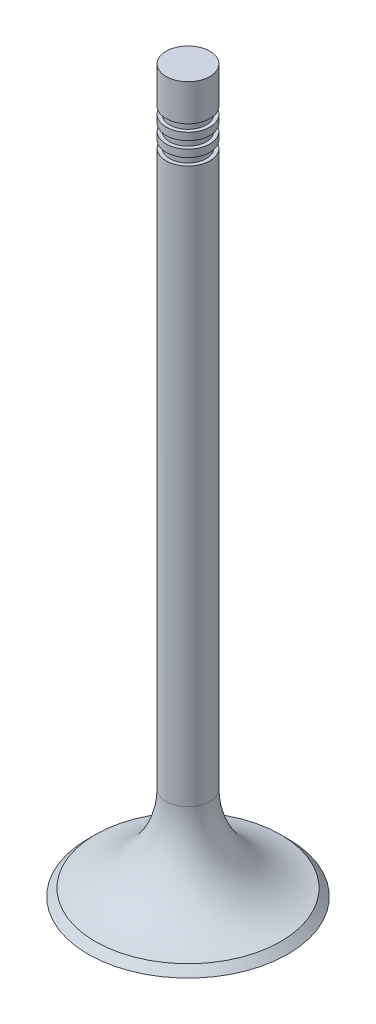
ISO-10303-21;
HEADER;
FILE_DESCRIPTION(('STEP AP214'),'2;1');
FILE_NAME('part.step','',(''),(''),'','','');
FILE_SCHEMA(('AUTOMOTIVE_DESIGN { 1 0 10303 214 1 1 1 1 }'));
ENDSEC;
DATA;
#1=APPLICATION_CONTEXT('core data for automotive mechanical design processes');
#2=APPLICATION_PROTOCOL_DEFINITION('international standard','automotive_design',2000,#1);
#3=PRODUCT_CONTEXT('',#1,'mechanical');
#4=PRODUCT('Part','Part','',(#3));
#5=PRODUCT_RELATED_PRODUCT_CATEGORY('part','',(#4));
#6=PRODUCT_DEFINITION_FORMATION('','',#4);
#7=PRODUCT_DEFINITION_CONTEXT('part definition',#1,'design');
#8=PRODUCT_DEFINITION('design','',#6,#7);
#9=PRODUCT_DEFINITION_SHAPE('','',#8);
#10=(LENGTH_UNIT() NAMED_UNIT(*) SI_UNIT(.MILLI.,.METRE.));
#11=(NAMED_UNIT(*) PLANE_ANGLE_UNIT() SI_UNIT($,.RADIAN.));
#12=(NAMED_UNIT(*) SI_UNIT($,.STERADIAN.) SOLID_ANGLE_UNIT());
#13=UNCERTAINTY_MEASURE_WITH_UNIT(LENGTH_MEASURE(1.E-05),#10,'distance_accuracy_value','');
#14=(GEOMETRIC_REPRESENTATION_CONTEXT(3) GLOBAL_UNCERTAINTY_ASSIGNED_CONTEXT((#13)) GLOBAL_UNIT_ASSIGNED_CONTEXT((#10,
#11,#12)) REPRESENTATION_CONTEXT('',''));
#15=CARTESIAN_POINT('',(0.,0.,0.));
#16=DIRECTION('',(0.,0.,1.));
#17=DIRECTION('',(1.,0.,0.));
#18=AXIS2_PLACEMENT_3D('',#15,#16,#17);
#19=CARTESIAN_POINT('',(0.,0.,0.));
#20=DIRECTION('',(0.,1.,0.));
#21=DIRECTION('',(0.,0.,1.));
#22=AXIS2_PLACEMENT_3D('',#19,#20,#21);
#23=PLANE('',#22);
#24=CARTESIAN_POINT('',(0.,0.,0.));
#25=DIRECTION('',(0.,1.,0.));
#26=DIRECTION('',(0.,0.,1.));
#27=AXIS2_PLACEMENT_3D('',#24,#25,#26);
#28=CIRCLE('',#27,13.7);
#29=CARTESIAN_POINT('',(0.,0.,13.7));
#30=VERTEX_POINT('',#29);
#31=EDGE_CURVE('E58',#30,#30,#28,.T.);
#32=ORIENTED_EDGE('',*,*,#31,.F.);
#33=EDGE_LOOP('',(#32));
#34=FACE_BOUND('',#33,.T.);
#35=ADVANCED_FACE('F45',(#34),#23,.F.);
#36=CARTESIAN_POINT('',(0.,1.,0.));
#37=DIRECTION('',(0.,-1.,0.));
#38=DIRECTION('',(0.,0.,-1.));
#39=AXIS2_PLACEMENT_3D('',#36,#37,#38);
#40=CONICAL_SURFACE('',#39,12.7,0.785398163397444);
#41=ORIENTED_EDGE('',*,*,#31,.T.);
#42=EDGE_LOOP('',(#41));
#43=FACE_BOUND('',#42,.T.);
#44=CARTESIAN_POINT('',(0.,1.,0.));
#45=DIRECTION('',(0.,1.,0.));
#46=DIRECTION('',(0.,0.,1.));
#47=AXIS2_PLACEMENT_3D('',#44,#45,#46);
#48=CIRCLE('',#47,12.7);
#49=CARTESIAN_POINT('',(0.,1.,12.7));
#50=VERTEX_POINT('',#49);
#51=EDGE_CURVE('E53',#50,#50,#48,.T.);
#52=ORIENTED_EDGE('',*,*,#51,.F.);
#53=EDGE_LOOP('',(#52));
#54=FACE_BOUND('',#53,.T.);
#55=ADVANCED_FACE('F152',(#43,#54),#40,.T.);
#56=CARTESIAN_POINT('',(0.,98.8,0.));
#57=DIRECTION('',(0.,-1.,0.));
#58=DIRECTION('',(0.,0.,-1.));
#59=AXIS2_PLACEMENT_3D('',#56,#57,#58);
#60=CYLINDRICAL_SURFACE('',#59,3.);
#61=CARTESIAN_POINT('',(0.,88.8,0.));
#62=DIRECTION('',(0.,1.,0.));
#63=DIRECTION('',(0.,0.,1.));
#64=AXIS2_PLACEMENT_3D('',#61,#62,#63);
#65=CIRCLE('',#64,3.);
#66=CARTESIAN_POINT('',(0.,88.8,3.));
#67=VERTEX_POINT('',#66);
#68=EDGE_CURVE('E79',#67,#67,#65,.T.);
#69=ORIENTED_EDGE('',*,*,#68,.F.);
#70=EDGE_LOOP('',(#69));
#71=FACE_BOUND('',#70,.T.);
#72=CARTESIAN_POINT('',(0.,12.7775209615606,0.));
#73=DIRECTION('',(0.,-1.,0.));
#74=DIRECTION('',(0.,0.,-1.));
#75=AXIS2_PLACEMENT_3D('',#72,#73,#74);
#76=CIRCLE('',#75,3.);
#77=CARTESIAN_POINT('',(0.,12.7775209615606,-3.));
#78=VERTEX_POINT('',#77);
#79=EDGE_CURVE('E10',#78,#78,#76,.F.);
#80=ORIENTED_EDGE('',*,*,#79,.T.);
#81=EDGE_LOOP('',(#80));
#82=FACE_BOUND('',#81,.T.);
#83=ADVANCED_FACE('F158',(#71,#82),#60,.T.);
#84=CARTESIAN_POINT('',(0.,12.7775209615606,0.));
#85=DIRECTION('',(0.,-1.,0.));
#86=DIRECTION('',(0.,0.,-1.));
#87=AXIS2_PLACEMENT_3D('',#84,#85,#86);
#88=TOROIDAL_SURFACE('',#87,15.,12.);
#89=ORIENTED_EDGE('',*,*,#51,.T.);
#90=EDGE_LOOP('',(#89));
#91=FACE_BOUND('',#90,.T.);
#92=ORIENTED_EDGE('',*,*,#79,.F.);
#93=EDGE_LOOP('',(#92));
#94=FACE_BOUND('',#93,.T.);
#95=ADVANCED_FACE('F47',(#91,#94),#88,.F.);
#96=CARTESIAN_POINT('',(0.,98.8,0.));
#97=DIRECTION('',(0.,1.,0.));
#98=DIRECTION('',(0.,0.,1.));
#99=AXIS2_PLACEMENT_3D('',#96,#97,#98);
#100=CYLINDRICAL_SURFACE('',#99,2.5);
#101=CARTESIAN_POINT('',(0.,88.8,0.));
#102=DIRECTION('',(0.,1.,0.));
#103=DIRECTION('',(0.,0.,1.));
#104=AXIS2_PLACEMENT_3D('',#101,#102,#103);
#105=CIRCLE('',#104,2.5);
#106=CARTESIAN_POINT('',(0.,88.8,2.5));
#107=VERTEX_POINT('',#106);
#108=EDGE_CURVE('E83',#107,#107,#105,.T.);
#109=ORIENTED_EDGE('',*,*,#108,.T.);
#110=EDGE_LOOP('',(#109));
#111=FACE_BOUND('',#110,.T.);
#112=CARTESIAN_POINT('',(0.,89.8,0.));
#113=DIRECTION('',(0.,1.,0.));
#114=DIRECTION('',(0.,0.,1.));
#115=AXIS2_PLACEMENT_3D('',#112,#113,#114);
#116=CIRCLE('',#115,2.5);
#117=CARTESIAN_POINT('',(0.,89.8,2.5));
#118=VERTEX_POINT('',#117);
#119=EDGE_CURVE('E70',#118,#118,#116,.T.);
#120=ORIENTED_EDGE('',*,*,#119,.F.);
#121=EDGE_LOOP('',(#120));
#122=FACE_BOUND('',#121,.T.);
#123=ADVANCED_FACE('F170',(#111,#122),#100,.T.);
#124=CARTESIAN_POINT('',(0.,89.8,0.));
#125=DIRECTION('',(0.,-1.,0.));
#126=DIRECTION('',(0.,0.,-1.));
#127=AXIS2_PLACEMENT_3D('',#124,#125,#126);
#128=PLANE('',#127);
#129=ORIENTED_EDGE('',*,*,#119,.T.);
#130=EDGE_LOOP('',(#129));
#131=FACE_BOUND('',#130,.T.);
#132=CARTESIAN_POINT('',(0.,89.8,0.));
#133=DIRECTION('',(0.,1.,0.));
#134=DIRECTION('',(0.,0.,1.));
#135=AXIS2_PLACEMENT_3D('',#132,#133,#134);
#136=CIRCLE('',#135,3.);
#137=CARTESIAN_POINT('',(0.,89.8,3.));
#138=VERTEX_POINT('',#137);
#139=EDGE_CURVE('E75',#138,#138,#136,.T.);
#140=ORIENTED_EDGE('',*,*,#139,.F.);
#141=EDGE_LOOP('',(#140));
#142=FACE_BOUND('',#141,.T.);
#143=ADVANCED_FACE('F173',(#131,#142),#128,.T.);
#144=CARTESIAN_POINT('',(0.,88.8,0.));
#145=DIRECTION('',(0.,-1.,0.));
#146=DIRECTION('',(0.,0.,-1.));
#147=AXIS2_PLACEMENT_3D('',#144,#145,#146);
#148=PLANE('',#147);
#149=ORIENTED_EDGE('',*,*,#108,.F.);
#150=EDGE_LOOP('',(#149));
#151=FACE_BOUND('',#150,.T.);
#152=ORIENTED_EDGE('',*,*,#68,.T.);
#153=EDGE_LOOP('',(#152));
#154=FACE_BOUND('',#153,.T.);
#155=ADVANCED_FACE('F177',(#151,#154),#148,.F.);
#156=CARTESIAN_POINT('',(0.,90.8,0.));
#157=DIRECTION('',(0.,1.,0.));
#158=DIRECTION('',(0.,0.,1.));
#159=AXIS2_PLACEMENT_3D('',#156,#157,#158);
#160=CIRCLE('',#159,3.);
#161=CARTESIAN_POINT('',(0.,90.8,3.));
#162=VERTEX_POINT('',#161);
#163=EDGE_CURVE('E96',#162,#162,#160,.T.);
#164=ORIENTED_EDGE('',*,*,#163,.F.);
#165=EDGE_LOOP('',(#164));
#166=FACE_BOUND('',#165,.T.);
#167=ORIENTED_EDGE('',*,*,#139,.T.);
#168=EDGE_LOOP('',(#167));
#169=FACE_BOUND('',#168,.T.);
#170=ADVANCED_FACE('F134',(#166,#169),#60,.T.);
#171=CARTESIAN_POINT('',(0.,98.8,0.));
#172=DIRECTION('',(0.,1.,0.));
#173=DIRECTION('',(0.,0.,1.));
#174=AXIS2_PLACEMENT_3D('',#171,#172,#173);
#175=CYLINDRICAL_SURFACE('',#174,2.5);
#176=CARTESIAN_POINT('',(0.,90.8,0.));
#177=DIRECTION('',(0.,1.,0.));
#178=DIRECTION('',(0.,0.,1.));
#179=AXIS2_PLACEMENT_3D('',#176,#177,#178);
#180=CIRCLE('',#179,2.5);
#181=CARTESIAN_POINT('',(0.,90.8,2.5));
#182=VERTEX_POINT('',#181);
#183=EDGE_CURVE('E74',#182,#182,#180,.T.);
#184=ORIENTED_EDGE('',*,*,#183,.T.);
#185=EDGE_LOOP('',(#184));
#186=FACE_BOUND('',#185,.T.);
#187=CARTESIAN_POINT('',(0.,91.8,0.));
#188=DIRECTION('',(0.,1.,0.));
#189=DIRECTION('',(0.,0.,1.));
#190=AXIS2_PLACEMENT_3D('',#187,#188,#189);
#191=CIRCLE('',#190,2.5);
#192=CARTESIAN_POINT('',(0.,91.8,2.5));
#193=VERTEX_POINT('',#192);
#194=EDGE_CURVE('E87',#193,#193,#191,.T.);
#195=ORIENTED_EDGE('',*,*,#194,.F.);
#196=EDGE_LOOP('',(#195));
#197=FACE_BOUND('',#196,.T.);
#198=ADVANCED_FACE('F140',(#186,#197),#175,.T.);
#199=CARTESIAN_POINT('',(0.,91.8,0.));
#200=DIRECTION('',(0.,-1.,0.));
#201=DIRECTION('',(0.,0.,-1.));
#202=AXIS2_PLACEMENT_3D('',#199,#200,#201);
#203=PLANE('',#202);
#204=ORIENTED_EDGE('',*,*,#194,.T.);
#205=EDGE_LOOP('',(#204));
#206=FACE_BOUND('',#205,.T.);
#207=CARTESIAN_POINT('',(0.,91.8,0.));
#208=DIRECTION('',(0.,1.,0.));
#209=DIRECTION('',(0.,0.,1.));
#210=AXIS2_PLACEMENT_3D('',#207,#208,#209);
#211=CIRCLE('',#210,3.);
#212=CARTESIAN_POINT('',(0.,91.8,3.));
#213=VERTEX_POINT('',#212);
#214=EDGE_CURVE('E92',#213,#213,#211,.T.);
#215=ORIENTED_EDGE('',*,*,#214,.F.);
#216=EDGE_LOOP('',(#215));
#217=FACE_BOUND('',#216,.T.);
#218=ADVANCED_FACE('F138',(#206,#217),#203,.T.);
#219=CARTESIAN_POINT('',(0.,90.8,0.));
#220=DIRECTION('',(0.,-1.,0.));
#221=DIRECTION('',(0.,0.,-1.));
#222=AXIS2_PLACEMENT_3D('',#219,#220,#221);
#223=PLANE('',#222);
#224=ORIENTED_EDGE('',*,*,#183,.F.);
#225=EDGE_LOOP('',(#224));
#226=FACE_BOUND('',#225,.T.);
#227=ORIENTED_EDGE('',*,*,#163,.T.);
#228=EDGE_LOOP('',(#227));
#229=FACE_BOUND('',#228,.T.);
#230=ADVANCED_FACE('F132',(#226,#229),#223,.F.);
#231=CARTESIAN_POINT('',(0.,92.8,0.));
#232=DIRECTION('',(0.,1.,0.));
#233=DIRECTION('',(0.,0.,1.));
#234=AXIS2_PLACEMENT_3D('',#231,#232,#233);
#235=CIRCLE('',#234,3.);
#236=CARTESIAN_POINT('',(0.,92.8,3.));
#237=VERTEX_POINT('',#236);
#238=EDGE_CURVE('E110',#237,#237,#235,.T.);
#239=ORIENTED_EDGE('',*,*,#238,.F.);
#240=EDGE_LOOP('',(#239));
#241=FACE_BOUND('',#240,.T.);
#242=ORIENTED_EDGE('',*,*,#214,.T.);
#243=EDGE_LOOP('',(#242));
#244=FACE_BOUND('',#243,.T.);
#245=ADVANCED_FACE('F129',(#241,#244),#60,.T.);
#246=CARTESIAN_POINT('',(0.,98.8,0.));
#247=DIRECTION('',(0.,1.,0.));
#248=DIRECTION('',(0.,0.,1.));
#249=AXIS2_PLACEMENT_3D('',#246,#247,#248);
#250=CYLINDRICAL_SURFACE('',#249,2.5);
#251=CARTESIAN_POINT('',(0.,92.8,0.));
#252=DIRECTION('',(0.,1.,0.));
#253=DIRECTION('',(0.,0.,1.));
#254=AXIS2_PLACEMENT_3D('',#251,#252,#253);
#255=CIRCLE('',#254,2.5);
#256=CARTESIAN_POINT('',(0.,92.8,2.5));
#257=VERTEX_POINT('',#256);
#258=EDGE_CURVE('E91',#257,#257,#255,.T.);
#259=ORIENTED_EDGE('',*,*,#258,.T.);
#260=EDGE_LOOP('',(#259));
#261=FACE_BOUND('',#260,.T.);
#262=CARTESIAN_POINT('',(0.,93.8,0.));
#263=DIRECTION('',(0.,1.,0.));
#264=DIRECTION('',(0.,0.,1.));
#265=AXIS2_PLACEMENT_3D('',#262,#263,#264);
#266=CIRCLE('',#265,2.5);
#267=CARTESIAN_POINT('',(0.,93.8,2.5));
#268=VERTEX_POINT('',#267);
#269=EDGE_CURVE('E69',#268,#268,#266,.T.);
#270=ORIENTED_EDGE('',*,*,#269,.F.);
#271=EDGE_LOOP('',(#270));
#272=FACE_BOUND('',#271,.T.);
#273=ADVANCED_FACE('F118',(#261,#272),#250,.T.);
#274=CARTESIAN_POINT('',(0.,93.8,0.));
#275=DIRECTION('',(0.,-1.,0.));
#276=DIRECTION('',(0.,0.,-1.));
#277=AXIS2_PLACEMENT_3D('',#274,#275,#276);
#278=PLANE('',#277);
#279=ORIENTED_EDGE('',*,*,#269,.T.);
#280=EDGE_LOOP('',(#279));
#281=FACE_BOUND('',#280,.T.);
#282=CARTESIAN_POINT('',(0.,93.8,0.));
#283=DIRECTION('',(0.,1.,0.));
#284=DIRECTION('',(0.,0.,1.));
#285=AXIS2_PLACEMENT_3D('',#282,#283,#284);
#286=CIRCLE('',#285,3.);
#287=CARTESIAN_POINT('',(0.,93.8,3.));
#288=VERTEX_POINT('',#287);
#289=EDGE_CURVE('E106',#288,#288,#286,.T.);
#290=ORIENTED_EDGE('',*,*,#289,.F.);
#291=EDGE_LOOP('',(#290));
#292=FACE_BOUND('',#291,.T.);
#293=ADVANCED_FACE('F125',(#281,#292),#278,.T.);
#294=CARTESIAN_POINT('',(0.,92.8,0.));
#295=DIRECTION('',(0.,-1.,0.));
#296=DIRECTION('',(0.,0.,-1.));
#297=AXIS2_PLACEMENT_3D('',#294,#295,#296);
#298=PLANE('',#297);
#299=ORIENTED_EDGE('',*,*,#258,.F.);
#300=EDGE_LOOP('',(#299));
#301=FACE_BOUND('',#300,.T.);
#302=ORIENTED_EDGE('',*,*,#238,.T.);
#303=EDGE_LOOP('',(#302));
#304=FACE_BOUND('',#303,.T.);
#305=ADVANCED_FACE('F121',(#301,#304),#298,.F.);
#306=CARTESIAN_POINT('',(0.,98.8,0.));
#307=DIRECTION('',(0.,1.,0.));
#308=DIRECTION('',(0.,0.,1.));
#309=AXIS2_PLACEMENT_3D('',#306,#307,#308);
#310=PLANE('',#309);
#311=CARTESIAN_POINT('',(0.,98.8,0.));
#312=DIRECTION('',(0.,1.,0.));
#313=DIRECTION('',(0.,0.,1.));
#314=AXIS2_PLACEMENT_3D('',#311,#312,#313);
#315=CIRCLE('',#314,3.);
#316=CARTESIAN_POINT('',(0.,98.8,3.));
#317=VERTEX_POINT('',#316);
#318=EDGE_CURVE('E63',#317,#317,#315,.T.);
#319=ORIENTED_EDGE('',*,*,#318,.T.);
#320=EDGE_LOOP('',(#319));
#321=FACE_BOUND('',#320,.T.);
#322=ADVANCED_FACE('F124',(#321),#310,.T.);
#323=ORIENTED_EDGE('',*,*,#318,.F.);
#324=EDGE_LOOP('',(#323));
#325=FACE_BOUND('',#324,.T.);
#326=ORIENTED_EDGE('',*,*,#289,.T.);
#327=EDGE_LOOP('',(#326));
#328=FACE_BOUND('',#327,.T.);
#329=ADVANCED_FACE('F135',(#325,#328),#60,.T.);
#330=CLOSED_SHELL('',(#35,#55,#83,#95,#123,#143,#155,#170,#198,#218,#230,#245,#273,#293,#305,
#322,#329));
#331=MANIFOLD_SOLID_BREP('B2',#330);
#332=ADVANCED_BREP_SHAPE_REPRESENTATION('',(#18,#331),#14);
#333=SHAPE_DEFINITION_REPRESENTATION(#9,#332);
ENDSEC;
END-ISO-10303-21;
